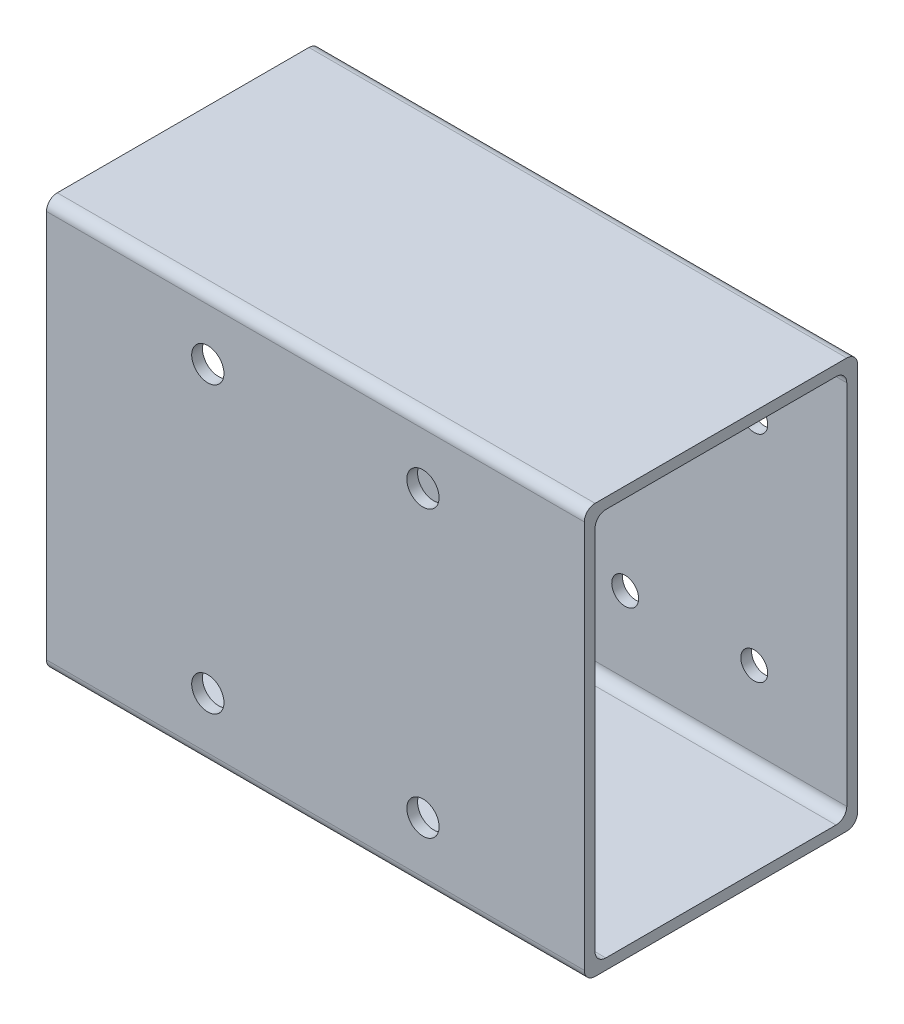
ISO-10303-21;
HEADER;
FILE_DESCRIPTION(('STEP AP214'),'2;1');
FILE_NAME('part.step','',(''),(''),'','','');
FILE_SCHEMA(('AUTOMOTIVE_DESIGN { 1 0 10303 214 1 1 1 1 }'));
ENDSEC;
DATA;
#1=APPLICATION_CONTEXT('core data for automotive mechanical design processes');
#2=APPLICATION_PROTOCOL_DEFINITION('international standard','automotive_design',2000,#1);
#3=PRODUCT_CONTEXT('',#1,'mechanical');
#4=PRODUCT('Part','Part','',(#3));
#5=PRODUCT_RELATED_PRODUCT_CATEGORY('part','',(#4));
#6=PRODUCT_DEFINITION_FORMATION('','',#4);
#7=PRODUCT_DEFINITION_CONTEXT('part definition',#1,'design');
#8=PRODUCT_DEFINITION('design','',#6,#7);
#9=PRODUCT_DEFINITION_SHAPE('','',#8);
#10=(LENGTH_UNIT() NAMED_UNIT(*) SI_UNIT(.MILLI.,.METRE.));
#11=(NAMED_UNIT(*) PLANE_ANGLE_UNIT() SI_UNIT($,.RADIAN.));
#12=(NAMED_UNIT(*) SI_UNIT($,.STERADIAN.) SOLID_ANGLE_UNIT());
#13=UNCERTAINTY_MEASURE_WITH_UNIT(LENGTH_MEASURE(1.E-05),#10,'distance_accuracy_value','');
#14=(GEOMETRIC_REPRESENTATION_CONTEXT(3) GLOBAL_UNCERTAINTY_ASSIGNED_CONTEXT((#13)) GLOBAL_UNIT_ASSIGNED_CONTEXT((#10,
#11,#12)) REPRESENTATION_CONTEXT('',''));
#15=CARTESIAN_POINT('',(0.,0.,0.));
#16=DIRECTION('',(0.,0.,1.));
#17=DIRECTION('',(1.,0.,0.));
#18=AXIS2_PLACEMENT_3D('',#15,#16,#17);
#19=CARTESIAN_POINT('',(-100.,38.1,25.4));
#20=DIRECTION('',(0.,0.,1.));
#21=DIRECTION('',(0.,-1.,0.));
#22=AXIS2_PLACEMENT_3D('',#19,#20,#21);
#23=PLANE('',#22);
#24=CARTESIAN_POINT('',(-30.,-26.5,25.4));
#25=DIRECTION('',(0.,0.,1.));
#26=DIRECTION('',(1.,0.,0.));
#27=AXIS2_PLACEMENT_3D('',#24,#25,#26);
#28=CIRCLE('',#27,3.);
#29=CARTESIAN_POINT('',(-27.,-26.5,25.4));
#30=VERTEX_POINT('',#29);
#31=EDGE_CURVE('E324',#30,#30,#28,.T.);
#32=ORIENTED_EDGE('',*,*,#31,.F.);
#33=EDGE_LOOP('',(#32));
#34=FACE_BOUND('',#33,.T.);
#35=CARTESIAN_POINT('',(-70.,-26.5,25.4));
#36=DIRECTION('',(0.,0.,1.));
#37=DIRECTION('',(1.,0.,0.));
#38=AXIS2_PLACEMENT_3D('',#35,#36,#37);
#39=CIRCLE('',#38,3.00000000000001);
#40=CARTESIAN_POINT('',(-67.,-26.5,25.4));
#41=VERTEX_POINT('',#40);
#42=EDGE_CURVE('E363',#41,#41,#39,.T.);
#43=ORIENTED_EDGE('',*,*,#42,.F.);
#44=EDGE_LOOP('',(#43));
#45=FACE_BOUND('',#44,.T.);
#46=CARTESIAN_POINT('',(-70.,26.5,25.4));
#47=DIRECTION('',(0.,0.,1.));
#48=DIRECTION('',(1.,0.,0.));
#49=AXIS2_PLACEMENT_3D('',#46,#47,#48);
#50=CIRCLE('',#49,3.00000000000001);
#51=CARTESIAN_POINT('',(-67.,26.5,25.4));
#52=VERTEX_POINT('',#51);
#53=EDGE_CURVE('E359',#52,#52,#50,.T.);
#54=ORIENTED_EDGE('',*,*,#53,.F.);
#55=EDGE_LOOP('',(#54));
#56=FACE_BOUND('',#55,.T.);
#57=CARTESIAN_POINT('',(-30.,26.5,25.4));
#58=DIRECTION('',(0.,0.,1.));
#59=DIRECTION('',(1.,0.,0.));
#60=AXIS2_PLACEMENT_3D('',#57,#58,#59);
#61=CIRCLE('',#60,3.);
#62=CARTESIAN_POINT('',(-27.,26.5,25.4));
#63=VERTEX_POINT('',#62);
#64=EDGE_CURVE('E290',#63,#63,#61,.T.);
#65=ORIENTED_EDGE('',*,*,#64,.F.);
#66=EDGE_LOOP('',(#65));
#67=FACE_BOUND('',#66,.T.);
#68=DIRECTION('',(0.,-1.,0.));
#69=VECTOR('',#68,1.);
#70=CARTESIAN_POINT('',(-100.,38.1,25.4));
#71=LINE('',#70,#69);
#72=CARTESIAN_POINT('',(-100.,36.1,25.4));
#73=VERTEX_POINT('',#72);
#74=CARTESIAN_POINT('',(-100.,-36.0999999999999,25.4));
#75=VERTEX_POINT('',#74);
#76=EDGE_CURVE('E404',#73,#75,#71,.T.);
#77=ORIENTED_EDGE('',*,*,#76,.T.);
#78=DIRECTION('',(1.,0.,0.));
#79=VECTOR('',#78,1.);
#80=CARTESIAN_POINT('',(-100.,-36.1,25.4));
#81=LINE('',#80,#79);
#82=CARTESIAN_POINT('',(0.,-36.0999999999999,25.4));
#83=VERTEX_POINT('',#82);
#84=EDGE_CURVE('E228',#75,#83,#81,.T.);
#85=ORIENTED_EDGE('',*,*,#84,.T.);
#86=DIRECTION('',(0.,-1.,0.));
#87=VECTOR('',#86,1.);
#88=CARTESIAN_POINT('',(0.,38.1,25.4));
#89=LINE('',#88,#87);
#90=CARTESIAN_POINT('',(0.,36.1,25.4));
#91=VERTEX_POINT('',#90);
#92=EDGE_CURVE('E166',#91,#83,#89,.T.);
#93=ORIENTED_EDGE('',*,*,#92,.F.);
#94=DIRECTION('',(1.,0.,0.));
#95=VECTOR('',#94,1.);
#96=CARTESIAN_POINT('',(-100.,36.1,25.4));
#97=LINE('',#96,#95);
#98=EDGE_CURVE('E225',#91,#73,#97,.F.);
#99=ORIENTED_EDGE('',*,*,#98,.T.);
#100=EDGE_LOOP('',(#77,#85,#93,#99));
#101=FACE_BOUND('',#100,.T.);
#102=ADVANCED_FACE('F44',(#34,#45,#56,#67,#101),#23,.T.);
#103=CARTESIAN_POINT('',(-100.,38.1,-25.4));
#104=DIRECTION('',(0.,1.,0.));
#105=DIRECTION('',(0.,0.,1.));
#106=AXIS2_PLACEMENT_3D('',#103,#104,#105);
#107=PLANE('',#106);
#108=DIRECTION('',(0.,0.,1.));
#109=VECTOR('',#108,1.);
#110=CARTESIAN_POINT('',(-100.,38.1,-25.4));
#111=LINE('',#110,#109);
#112=CARTESIAN_POINT('',(-100.,38.1,-23.4));
#113=VERTEX_POINT('',#112);
#114=CARTESIAN_POINT('',(-100.,38.1,23.4));
#115=VERTEX_POINT('',#114);
#116=EDGE_CURVE('E190',#113,#115,#111,.T.);
#117=ORIENTED_EDGE('',*,*,#116,.T.);
#118=DIRECTION('',(1.,0.,0.));
#119=VECTOR('',#118,1.);
#120=CARTESIAN_POINT('',(-100.,38.1,23.4));
#121=LINE('',#120,#119);
#122=CARTESIAN_POINT('',(0.,38.1,23.4));
#123=VERTEX_POINT('',#122);
#124=EDGE_CURVE('E233',#115,#123,#121,.T.);
#125=ORIENTED_EDGE('',*,*,#124,.T.);
#126=DIRECTION('',(0.,0.,1.));
#127=VECTOR('',#126,1.);
#128=CARTESIAN_POINT('',(0.,38.1,-25.4));
#129=LINE('',#128,#127);
#130=CARTESIAN_POINT('',(0.,38.1,-23.4));
#131=VERTEX_POINT('',#130);
#132=EDGE_CURVE('E199',#131,#123,#129,.T.);
#133=ORIENTED_EDGE('',*,*,#132,.F.);
#134=DIRECTION('',(1.,0.,0.));
#135=VECTOR('',#134,1.);
#136=CARTESIAN_POINT('',(-100.,38.1,-23.4));
#137=LINE('',#136,#135);
#138=EDGE_CURVE('E69',#131,#113,#137,.F.);
#139=ORIENTED_EDGE('',*,*,#138,.T.);
#140=EDGE_LOOP('',(#117,#125,#133,#139));
#141=FACE_BOUND('',#140,.T.);
#142=ADVANCED_FACE('F420',(#141),#107,.T.);
#143=CARTESIAN_POINT('',(-100.,38.1,-25.4));
#144=DIRECTION('',(0.,0.,-1.));
#145=DIRECTION('',(0.,1.,0.));
#146=AXIS2_PLACEMENT_3D('',#143,#144,#145);
#147=PLANE('',#146);
#148=CARTESIAN_POINT('',(-17.2,-20.,-25.4));
#149=DIRECTION('',(0.,0.,-1.));
#150=DIRECTION('',(0.,1.,0.));
#151=AXIS2_PLACEMENT_3D('',#148,#149,#150);
#152=CIRCLE('',#151,2.5);
#153=CARTESIAN_POINT('',(-17.2,-17.5,-25.4));
#154=VERTEX_POINT('',#153);
#155=EDGE_CURVE('E491',#154,#154,#152,.T.);
#156=ORIENTED_EDGE('',*,*,#155,.F.);
#157=EDGE_LOOP('',(#156));
#158=FACE_BOUND('',#157,.T.);
#159=CARTESIAN_POINT('',(-41.2,-20.,-25.4));
#160=DIRECTION('',(0.,0.,-1.));
#161=DIRECTION('',(0.,1.,0.));
#162=AXIS2_PLACEMENT_3D('',#159,#160,#161);
#163=CIRCLE('',#162,2.5);
#164=CARTESIAN_POINT('',(-41.2,-17.5,-25.4));
#165=VERTEX_POINT('',#164);
#166=EDGE_CURVE('E495',#165,#165,#163,.T.);
#167=ORIENTED_EDGE('',*,*,#166,.F.);
#168=EDGE_LOOP('',(#167));
#169=FACE_BOUND('',#168,.T.);
#170=CARTESIAN_POINT('',(-41.2,20.,-25.4));
#171=DIRECTION('',(0.,0.,-1.));
#172=DIRECTION('',(0.,1.,0.));
#173=AXIS2_PLACEMENT_3D('',#170,#171,#172);
#174=CIRCLE('',#173,2.5);
#175=CARTESIAN_POINT('',(-41.2,22.5,-25.4));
#176=VERTEX_POINT('',#175);
#177=EDGE_CURVE('E499',#176,#176,#174,.T.);
#178=ORIENTED_EDGE('',*,*,#177,.F.);
#179=EDGE_LOOP('',(#178));
#180=FACE_BOUND('',#179,.T.);
#181=CARTESIAN_POINT('',(-17.2,20.,-25.4));
#182=DIRECTION('',(0.,0.,-1.));
#183=DIRECTION('',(0.,1.,0.));
#184=AXIS2_PLACEMENT_3D('',#181,#182,#183);
#185=CIRCLE('',#184,2.5);
#186=CARTESIAN_POINT('',(-17.2,22.5,-25.4));
#187=VERTEX_POINT('',#186);
#188=EDGE_CURVE('E330',#187,#187,#185,.T.);
#189=ORIENTED_EDGE('',*,*,#188,.F.);
#190=EDGE_LOOP('',(#189));
#191=FACE_BOUND('',#190,.T.);
#192=CARTESIAN_POINT('',(-74.6,0.,-25.4));
#193=DIRECTION('',(0.,0.,-1.));
#194=DIRECTION('',(0.,1.,0.));
#195=AXIS2_PLACEMENT_3D('',#192,#193,#194);
#196=CIRCLE('',#195,2.5);
#197=CARTESIAN_POINT('',(-74.6,2.49999999999999,-25.4));
#198=VERTEX_POINT('',#197);
#199=EDGE_CURVE('E340',#198,#198,#196,.T.);
#200=ORIENTED_EDGE('',*,*,#199,.F.);
#201=EDGE_LOOP('',(#200));
#202=FACE_BOUND('',#201,.T.);
#203=CARTESIAN_POINT('',(-90.,-20.,-25.4));
#204=DIRECTION('',(0.,0.,-1.));
#205=DIRECTION('',(0.,1.,0.));
#206=AXIS2_PLACEMENT_3D('',#203,#204,#205);
#207=CIRCLE('',#206,2.50000000000001);
#208=CARTESIAN_POINT('',(-90.,-17.5,-25.4));
#209=VERTEX_POINT('',#208);
#210=EDGE_CURVE('E345',#209,#209,#207,.T.);
#211=ORIENTED_EDGE('',*,*,#210,.F.);
#212=EDGE_LOOP('',(#211));
#213=FACE_BOUND('',#212,.T.);
#214=CARTESIAN_POINT('',(-59.2,-20.,-25.4));
#215=DIRECTION('',(0.,0.,-1.));
#216=DIRECTION('',(0.,1.,0.));
#217=AXIS2_PLACEMENT_3D('',#214,#215,#216);
#218=CIRCLE('',#217,2.5);
#219=CARTESIAN_POINT('',(-59.2,-17.5,-25.4));
#220=VERTEX_POINT('',#219);
#221=EDGE_CURVE('E351',#220,#220,#218,.T.);
#222=ORIENTED_EDGE('',*,*,#221,.F.);
#223=EDGE_LOOP('',(#222));
#224=FACE_BOUND('',#223,.T.);
#225=CARTESIAN_POINT('',(-59.2,20.,-25.4));
#226=DIRECTION('',(0.,0.,-1.));
#227=DIRECTION('',(0.,1.,0.));
#228=AXIS2_PLACEMENT_3D('',#225,#226,#227);
#229=CIRCLE('',#228,2.5);
#230=CARTESIAN_POINT('',(-59.2,22.5,-25.4));
#231=VERTEX_POINT('',#230);
#232=EDGE_CURVE('E358',#231,#231,#229,.T.);
#233=ORIENTED_EDGE('',*,*,#232,.F.);
#234=EDGE_LOOP('',(#233));
#235=FACE_BOUND('',#234,.T.);
#236=CARTESIAN_POINT('',(-90.,20.,-25.4));
#237=DIRECTION('',(0.,0.,-1.));
#238=DIRECTION('',(0.,1.,0.));
#239=AXIS2_PLACEMENT_3D('',#236,#237,#238);
#240=CIRCLE('',#239,2.5);
#241=CARTESIAN_POINT('',(-90.,22.5,-25.4));
#242=VERTEX_POINT('',#241);
#243=EDGE_CURVE('E308',#242,#242,#240,.T.);
#244=ORIENTED_EDGE('',*,*,#243,.F.);
#245=EDGE_LOOP('',(#244));
#246=FACE_BOUND('',#245,.T.);
#247=DIRECTION('',(0.,1.,0.));
#248=VECTOR('',#247,1.);
#249=CARTESIAN_POINT('',(0.,38.1,-25.4));
#250=LINE('',#249,#248);
#251=CARTESIAN_POINT('',(0.,-36.0999999999999,-25.4));
#252=VERTEX_POINT('',#251);
#253=CARTESIAN_POINT('',(0.,36.1,-25.4));
#254=VERTEX_POINT('',#253);
#255=EDGE_CURVE('E184',#252,#254,#250,.T.);
#256=ORIENTED_EDGE('',*,*,#255,.F.);
#257=DIRECTION('',(1.,0.,0.));
#258=VECTOR('',#257,1.);
#259=CARTESIAN_POINT('',(-100.,-36.1,-25.4));
#260=LINE('',#259,#258);
#261=CARTESIAN_POINT('',(-100.,-36.0999999999999,-25.4));
#262=VERTEX_POINT('',#261);
#263=EDGE_CURVE('E212',#252,#262,#260,.F.);
#264=ORIENTED_EDGE('',*,*,#263,.T.);
#265=DIRECTION('',(0.,1.,0.));
#266=VECTOR('',#265,1.);
#267=CARTESIAN_POINT('',(-100.,38.1,-25.4));
#268=LINE('',#267,#266);
#269=CARTESIAN_POINT('',(-100.,36.1,-25.4));
#270=VERTEX_POINT('',#269);
#271=EDGE_CURVE('E196',#262,#270,#268,.T.);
#272=ORIENTED_EDGE('',*,*,#271,.T.);
#273=DIRECTION('',(1.,0.,0.));
#274=VECTOR('',#273,1.);
#275=CARTESIAN_POINT('',(-100.,36.1,-25.4));
#276=LINE('',#275,#274);
#277=EDGE_CURVE('E208',#270,#254,#276,.T.);
#278=ORIENTED_EDGE('',*,*,#277,.T.);
#279=EDGE_LOOP('',(#256,#264,#272,#278));
#280=FACE_BOUND('',#279,.T.);
#281=ADVANCED_FACE('F430',(#158,#169,#180,#191,#202,#213,#224,#235,#246,#280),#147,.T.);
#282=CARTESIAN_POINT('',(-100.,-38.1,-25.4));
#283=DIRECTION('',(0.,-1.,0.));
#284=DIRECTION('',(0.,0.,-1.));
#285=AXIS2_PLACEMENT_3D('',#282,#283,#284);
#286=PLANE('',#285);
#287=DIRECTION('',(0.,0.,-1.));
#288=VECTOR('',#287,1.);
#289=CARTESIAN_POINT('',(-100.,-38.1,-25.4));
#290=LINE('',#289,#288);
#291=CARTESIAN_POINT('',(-100.,-38.1,23.4));
#292=VERTEX_POINT('',#291);
#293=CARTESIAN_POINT('',(-100.,-38.1,-23.4));
#294=VERTEX_POINT('',#293);
#295=EDGE_CURVE('E408',#292,#294,#290,.T.);
#296=ORIENTED_EDGE('',*,*,#295,.T.);
#297=DIRECTION('',(1.,0.,0.));
#298=VECTOR('',#297,1.);
#299=CARTESIAN_POINT('',(-100.,-38.1,-23.4));
#300=LINE('',#299,#298);
#301=CARTESIAN_POINT('',(0.,-38.1,-23.4));
#302=VERTEX_POINT('',#301);
#303=EDGE_CURVE('E182',#294,#302,#300,.T.);
#304=ORIENTED_EDGE('',*,*,#303,.T.);
#305=DIRECTION('',(0.,0.,-1.));
#306=VECTOR('',#305,1.);
#307=CARTESIAN_POINT('',(0.,-38.1,-25.4));
#308=LINE('',#307,#306);
#309=CARTESIAN_POINT('',(0.,-38.1,23.4));
#310=VERTEX_POINT('',#309);
#311=EDGE_CURVE('E164',#310,#302,#308,.T.);
#312=ORIENTED_EDGE('',*,*,#311,.F.);
#313=DIRECTION('',(1.,0.,0.));
#314=VECTOR('',#313,1.);
#315=CARTESIAN_POINT('',(-100.,-38.1,23.4));
#316=LINE('',#315,#314);
#317=EDGE_CURVE('E179',#310,#292,#316,.F.);
#318=ORIENTED_EDGE('',*,*,#317,.T.);
#319=EDGE_LOOP('',(#296,#304,#312,#318));
#320=FACE_BOUND('',#319,.T.);
#321=ADVANCED_FACE('F178',(#320),#286,.T.);
#322=CARTESIAN_POINT('',(-100.,0.,0.));
#323=DIRECTION('',(-1.,0.,0.));
#324=DIRECTION('',(0.,0.,1.));
#325=AXIS2_PLACEMENT_3D('',#322,#323,#324);
#326=PLANE('',#325);
#327=DIRECTION('',(0.,0.,1.));
#328=VECTOR('',#327,1.);
#329=CARTESIAN_POINT('',(-100.,36.1,-23.4));
#330=LINE('',#329,#328);
#331=CARTESIAN_POINT('',(-100.,36.1,-21.4));
#332=VERTEX_POINT('',#331);
#333=CARTESIAN_POINT('',(-100.,36.1,21.4));
#334=VERTEX_POINT('',#333);
#335=EDGE_CURVE('E386',#332,#334,#330,.T.);
#336=ORIENTED_EDGE('',*,*,#335,.T.);
#337=CARTESIAN_POINT('',(-100.,34.1,21.4));
#338=DIRECTION('',(-1.,0.,0.));
#339=DIRECTION('',(0.,0.,1.));
#340=AXIS2_PLACEMENT_3D('',#337,#338,#339);
#341=CIRCLE('',#340,2.);
#342=CARTESIAN_POINT('',(-100.,34.1,23.4));
#343=VERTEX_POINT('',#342);
#344=EDGE_CURVE('E11',#334,#343,#341,.F.);
#345=ORIENTED_EDGE('',*,*,#344,.T.);
#346=DIRECTION('',(0.,-1.,0.));
#347=VECTOR('',#346,1.);
#348=CARTESIAN_POINT('',(-100.,36.1,23.4));
#349=LINE('',#348,#347);
#350=CARTESIAN_POINT('',(-100.,-34.1,23.4));
#351=VERTEX_POINT('',#350);
#352=EDGE_CURVE('E373',#343,#351,#349,.T.);
#353=ORIENTED_EDGE('',*,*,#352,.T.);
#354=CARTESIAN_POINT('',(-100.,-34.1,21.4));
#355=DIRECTION('',(-1.,0.,0.));
#356=DIRECTION('',(0.,0.,1.));
#357=AXIS2_PLACEMENT_3D('',#354,#355,#356);
#358=CIRCLE('',#357,2.);
#359=CARTESIAN_POINT('',(-100.,-36.1,21.4));
#360=VERTEX_POINT('',#359);
#361=EDGE_CURVE('E280',#351,#360,#358,.F.);
#362=ORIENTED_EDGE('',*,*,#361,.T.);
#363=DIRECTION('',(0.,0.,-1.));
#364=VECTOR('',#363,1.);
#365=CARTESIAN_POINT('',(-100.,-36.1,-23.4));
#366=LINE('',#365,#364);
#367=CARTESIAN_POINT('',(-100.,-36.1,-21.4));
#368=VERTEX_POINT('',#367);
#369=EDGE_CURVE('E377',#360,#368,#366,.T.);
#370=ORIENTED_EDGE('',*,*,#369,.T.);
#371=CARTESIAN_POINT('',(-100.,-34.1,-21.4));
#372=DIRECTION('',(-1.,0.,0.));
#373=DIRECTION('',(0.,0.,1.));
#374=AXIS2_PLACEMENT_3D('',#371,#372,#373);
#375=CIRCLE('',#374,2.);
#376=CARTESIAN_POINT('',(-100.,-34.1,-23.4));
#377=VERTEX_POINT('',#376);
#378=EDGE_CURVE('E268',#368,#377,#375,.F.);
#379=ORIENTED_EDGE('',*,*,#378,.T.);
#380=DIRECTION('',(0.,1.,0.));
#381=VECTOR('',#380,1.);
#382=CARTESIAN_POINT('',(-100.,36.1,-23.4));
#383=LINE('',#382,#381);
#384=CARTESIAN_POINT('',(-100.,34.1,-23.4));
#385=VERTEX_POINT('',#384);
#386=EDGE_CURVE('E382',#377,#385,#383,.T.);
#387=ORIENTED_EDGE('',*,*,#386,.T.);
#388=CARTESIAN_POINT('',(-100.,34.1,-21.4));
#389=DIRECTION('',(-1.,0.,0.));
#390=DIRECTION('',(0.,0.,1.));
#391=AXIS2_PLACEMENT_3D('',#388,#389,#390);
#392=CIRCLE('',#391,2.);
#393=EDGE_CURVE('E274',#385,#332,#392,.F.);
#394=ORIENTED_EDGE('',*,*,#393,.T.);
#395=EDGE_LOOP('',(#336,#345,#353,#362,#370,#379,#387,#394));
#396=FACE_BOUND('',#395,.T.);
#397=ORIENTED_EDGE('',*,*,#271,.F.);
#398=CARTESIAN_POINT('',(-100.,-36.1,-23.4));
#399=DIRECTION('',(-1.,0.,0.));
#400=DIRECTION('',(0.,0.,1.));
#401=AXIS2_PLACEMENT_3D('',#398,#399,#400);
#402=CIRCLE('',#401,2.);
#403=EDGE_CURVE('E222',#262,#294,#402,.T.);
#404=ORIENTED_EDGE('',*,*,#403,.T.);
#405=ORIENTED_EDGE('',*,*,#295,.F.);
#406=CARTESIAN_POINT('',(-100.,-36.1,23.4));
#407=DIRECTION('',(-1.,0.,0.));
#408=DIRECTION('',(0.,0.,1.));
#409=AXIS2_PLACEMENT_3D('',#406,#407,#408);
#410=CIRCLE('',#409,2.);
#411=EDGE_CURVE('E188',#292,#75,#410,.T.);
#412=ORIENTED_EDGE('',*,*,#411,.T.);
#413=ORIENTED_EDGE('',*,*,#76,.F.);
#414=CARTESIAN_POINT('',(-100.,36.1,23.4));
#415=DIRECTION('',(-1.,0.,0.));
#416=DIRECTION('',(0.,0.,1.));
#417=AXIS2_PLACEMENT_3D('',#414,#415,#416);
#418=CIRCLE('',#417,2.);
#419=EDGE_CURVE('E62',#73,#115,#418,.T.);
#420=ORIENTED_EDGE('',*,*,#419,.T.);
#421=ORIENTED_EDGE('',*,*,#116,.F.);
#422=CARTESIAN_POINT('',(-100.,36.1,-23.4));
#423=DIRECTION('',(-1.,0.,0.));
#424=DIRECTION('',(0.,0.,1.));
#425=AXIS2_PLACEMENT_3D('',#422,#423,#424);
#426=CIRCLE('',#425,2.);
#427=EDGE_CURVE('E215',#113,#270,#426,.T.);
#428=ORIENTED_EDGE('',*,*,#427,.T.);
#429=EDGE_LOOP('',(#397,#404,#405,#412,#413,#420,#421,#428));
#430=FACE_BOUND('',#429,.T.);
#431=ADVANCED_FACE('F427',(#396,#430),#326,.T.);
#432=CARTESIAN_POINT('',(0.,0.,0.));
#433=DIRECTION('',(-1.,0.,0.));
#434=DIRECTION('',(0.,0.,1.));
#435=AXIS2_PLACEMENT_3D('',#432,#433,#434);
#436=PLANE('',#435);
#437=DIRECTION('',(0.,0.,-1.));
#438=VECTOR('',#437,1.);
#439=CARTESIAN_POINT('',(0.,-36.1,-23.4));
#440=LINE('',#439,#438);
#441=CARTESIAN_POINT('',(0.,-36.1,21.4));
#442=VERTEX_POINT('',#441);
#443=CARTESIAN_POINT('',(0.,-36.1,-21.4));
#444=VERTEX_POINT('',#443);
#445=EDGE_CURVE('E393',#442,#444,#440,.T.);
#446=ORIENTED_EDGE('',*,*,#445,.F.);
#447=CARTESIAN_POINT('',(0.,-34.1,21.4));
#448=DIRECTION('',(-1.,0.,0.));
#449=DIRECTION('',(0.,0.,1.));
#450=AXIS2_PLACEMENT_3D('',#447,#448,#449);
#451=CIRCLE('',#450,2.);
#452=CARTESIAN_POINT('',(0.,-34.1,23.4));
#453=VERTEX_POINT('',#452);
#454=EDGE_CURVE('E277',#442,#453,#451,.T.);
#455=ORIENTED_EDGE('',*,*,#454,.T.);
#456=DIRECTION('',(0.,-1.,0.));
#457=VECTOR('',#456,1.);
#458=CARTESIAN_POINT('',(0.,36.1,23.4));
#459=LINE('',#458,#457);
#460=CARTESIAN_POINT('',(0.,34.1,23.4));
#461=VERTEX_POINT('',#460);
#462=EDGE_CURVE('E302',#461,#453,#459,.T.);
#463=ORIENTED_EDGE('',*,*,#462,.F.);
#464=CARTESIAN_POINT('',(0.,34.1,21.4));
#465=DIRECTION('',(-1.,0.,0.));
#466=DIRECTION('',(0.,0.,1.));
#467=AXIS2_PLACEMENT_3D('',#464,#465,#466);
#468=CIRCLE('',#467,2.);
#469=CARTESIAN_POINT('',(0.,36.1,21.4));
#470=VERTEX_POINT('',#469);
#471=EDGE_CURVE('E54',#461,#470,#468,.T.);
#472=ORIENTED_EDGE('',*,*,#471,.T.);
#473=DIRECTION('',(0.,0.,1.));
#474=VECTOR('',#473,1.);
#475=CARTESIAN_POINT('',(0.,36.1,-23.4));
#476=LINE('',#475,#474);
#477=CARTESIAN_POINT('',(0.,36.1,-21.4));
#478=VERTEX_POINT('',#477);
#479=EDGE_CURVE('E378',#478,#470,#476,.T.);
#480=ORIENTED_EDGE('',*,*,#479,.F.);
#481=CARTESIAN_POINT('',(0.,34.1,-21.4));
#482=DIRECTION('',(-1.,0.,0.));
#483=DIRECTION('',(0.,0.,1.));
#484=AXIS2_PLACEMENT_3D('',#481,#482,#483);
#485=CIRCLE('',#484,2.);
#486=CARTESIAN_POINT('',(0.,34.1,-23.4));
#487=VERTEX_POINT('',#486);
#488=EDGE_CURVE('E271',#478,#487,#485,.T.);
#489=ORIENTED_EDGE('',*,*,#488,.T.);
#490=DIRECTION('',(0.,1.,0.));
#491=VECTOR('',#490,1.);
#492=CARTESIAN_POINT('',(0.,36.1,-23.4));
#493=LINE('',#492,#491);
#494=CARTESIAN_POINT('',(0.,-34.1,-23.4));
#495=VERTEX_POINT('',#494);
#496=EDGE_CURVE('E397',#495,#487,#493,.T.);
#497=ORIENTED_EDGE('',*,*,#496,.F.);
#498=CARTESIAN_POINT('',(0.,-34.1,-21.4));
#499=DIRECTION('',(-1.,0.,0.));
#500=DIRECTION('',(0.,0.,1.));
#501=AXIS2_PLACEMENT_3D('',#498,#499,#500);
#502=CIRCLE('',#501,2.);
#503=EDGE_CURVE('E265',#495,#444,#502,.T.);
#504=ORIENTED_EDGE('',*,*,#503,.T.);
#505=EDGE_LOOP('',(#446,#455,#463,#472,#480,#489,#497,#504));
#506=FACE_BOUND('',#505,.T.);
#507=ORIENTED_EDGE('',*,*,#311,.T.);
#508=CARTESIAN_POINT('',(0.,-36.1,-23.4));
#509=DIRECTION('',(-1.,0.,0.));
#510=DIRECTION('',(0.,0.,1.));
#511=AXIS2_PLACEMENT_3D('',#508,#509,#510);
#512=CIRCLE('',#511,2.);
#513=EDGE_CURVE('E172',#302,#252,#512,.F.);
#514=ORIENTED_EDGE('',*,*,#513,.T.);
#515=ORIENTED_EDGE('',*,*,#255,.T.);
#516=CARTESIAN_POINT('',(0.,36.1,-23.4));
#517=DIRECTION('',(-1.,0.,0.));
#518=DIRECTION('',(0.,0.,1.));
#519=AXIS2_PLACEMENT_3D('',#516,#517,#518);
#520=CIRCLE('',#519,2.);
#521=EDGE_CURVE('E194',#254,#131,#520,.F.);
#522=ORIENTED_EDGE('',*,*,#521,.T.);
#523=ORIENTED_EDGE('',*,*,#132,.T.);
#524=CARTESIAN_POINT('',(0.,36.1,23.4));
#525=DIRECTION('',(-1.,0.,0.));
#526=DIRECTION('',(0.,0.,1.));
#527=AXIS2_PLACEMENT_3D('',#524,#525,#526);
#528=CIRCLE('',#527,2.);
#529=EDGE_CURVE('E173',#123,#91,#528,.F.);
#530=ORIENTED_EDGE('',*,*,#529,.T.);
#531=ORIENTED_EDGE('',*,*,#92,.T.);
#532=CARTESIAN_POINT('',(0.,-36.1,23.4));
#533=DIRECTION('',(-1.,0.,0.));
#534=DIRECTION('',(0.,0.,1.));
#535=AXIS2_PLACEMENT_3D('',#532,#533,#534);
#536=CIRCLE('',#535,2.);
#537=EDGE_CURVE('E161',#83,#310,#536,.F.);
#538=ORIENTED_EDGE('',*,*,#537,.T.);
#539=EDGE_LOOP('',(#507,#514,#515,#522,#523,#530,#531,#538));
#540=FACE_BOUND('',#539,.T.);
#541=ADVANCED_FACE('F163',(#506,#540),#436,.F.);
#542=CARTESIAN_POINT('',(-100.,36.1,23.4));
#543=DIRECTION('',(0.,0.,1.));
#544=DIRECTION('',(1.,0.,0.));
#545=AXIS2_PLACEMENT_3D('',#542,#543,#544);
#546=PLANE('',#545);
#547=CARTESIAN_POINT('',(-30.,-26.5,23.4));
#548=DIRECTION('',(0.,0.,1.));
#549=DIRECTION('',(1.,0.,0.));
#550=AXIS2_PLACEMENT_3D('',#547,#548,#549);
#551=CIRCLE('',#550,3.);
#552=CARTESIAN_POINT('',(-27.,-26.5,23.4));
#553=VERTEX_POINT('',#552);
#554=EDGE_CURVE('E298',#553,#553,#551,.T.);
#555=ORIENTED_EDGE('',*,*,#554,.T.);
#556=EDGE_LOOP('',(#555));
#557=FACE_BOUND('',#556,.T.);
#558=CARTESIAN_POINT('',(-70.,-26.5,23.4));
#559=DIRECTION('',(0.,0.,1.));
#560=DIRECTION('',(1.,0.,0.));
#561=AXIS2_PLACEMENT_3D('',#558,#559,#560);
#562=CIRCLE('',#561,3.00000000000001);
#563=CARTESIAN_POINT('',(-67.,-26.5,23.4));
#564=VERTEX_POINT('',#563);
#565=EDGE_CURVE('E294',#564,#564,#562,.T.);
#566=ORIENTED_EDGE('',*,*,#565,.T.);
#567=EDGE_LOOP('',(#566));
#568=FACE_BOUND('',#567,.T.);
#569=CARTESIAN_POINT('',(-70.,26.5,23.4));
#570=DIRECTION('',(0.,0.,1.));
#571=DIRECTION('',(1.,0.,0.));
#572=AXIS2_PLACEMENT_3D('',#569,#570,#571);
#573=CIRCLE('',#572,3.00000000000001);
#574=CARTESIAN_POINT('',(-67.,26.5,23.4));
#575=VERTEX_POINT('',#574);
#576=EDGE_CURVE('E289',#575,#575,#573,.T.);
#577=ORIENTED_EDGE('',*,*,#576,.T.);
#578=EDGE_LOOP('',(#577));
#579=FACE_BOUND('',#578,.T.);
#580=CARTESIAN_POINT('',(-30.,26.5,23.4));
#581=DIRECTION('',(0.,0.,1.));
#582=DIRECTION('',(1.,0.,0.));
#583=AXIS2_PLACEMENT_3D('',#580,#581,#582);
#584=CIRCLE('',#583,3.);
#585=CARTESIAN_POINT('',(-27.,26.5,23.4));
#586=VERTEX_POINT('',#585);
#587=EDGE_CURVE('E285',#586,#586,#584,.T.);
#588=ORIENTED_EDGE('',*,*,#587,.T.);
#589=EDGE_LOOP('',(#588));
#590=FACE_BOUND('',#589,.T.);
#591=ORIENTED_EDGE('',*,*,#462,.T.);
#592=DIRECTION('',(1.,0.,0.));
#593=VECTOR('',#592,1.);
#594=CARTESIAN_POINT('',(-100.,-34.1,23.4));
#595=LINE('',#594,#593);
#596=EDGE_CURVE('E262',#453,#351,#595,.F.);
#597=ORIENTED_EDGE('',*,*,#596,.T.);
#598=ORIENTED_EDGE('',*,*,#352,.F.);
#599=DIRECTION('',(1.,0.,0.));
#600=VECTOR('',#599,1.);
#601=CARTESIAN_POINT('',(0.,34.1,23.4));
#602=LINE('',#601,#600);
#603=EDGE_CURVE('E258',#343,#461,#602,.T.);
#604=ORIENTED_EDGE('',*,*,#603,.T.);
#605=EDGE_LOOP('',(#591,#597,#598,#604));
#606=FACE_BOUND('',#605,.T.);
#607=ADVANCED_FACE('F474',(#557,#568,#579,#590,#606),#546,.F.);
#608=CARTESIAN_POINT('',(-100.,36.1,-23.4));
#609=DIRECTION('',(0.,1.,0.));
#610=DIRECTION('',(0.,0.,1.));
#611=AXIS2_PLACEMENT_3D('',#608,#609,#610);
#612=PLANE('',#611);
#613=ORIENTED_EDGE('',*,*,#335,.F.);
#614=DIRECTION('',(1.,0.,0.));
#615=VECTOR('',#614,1.);
#616=CARTESIAN_POINT('',(0.,36.1,-21.4));
#617=LINE('',#616,#615);
#618=EDGE_CURVE('E254',#332,#478,#617,.T.);
#619=ORIENTED_EDGE('',*,*,#618,.T.);
#620=ORIENTED_EDGE('',*,*,#479,.T.);
#621=DIRECTION('',(1.,0.,0.));
#622=VECTOR('',#621,1.);
#623=CARTESIAN_POINT('',(-100.,36.1,21.4));
#624=LINE('',#623,#622);
#625=EDGE_CURVE('E251',#470,#334,#624,.F.);
#626=ORIENTED_EDGE('',*,*,#625,.T.);
#627=EDGE_LOOP('',(#613,#619,#620,#626));
#628=FACE_BOUND('',#627,.T.);
#629=ADVANCED_FACE('F470',(#628),#612,.F.);
#630=CARTESIAN_POINT('',(-100.,36.1,-23.4));
#631=DIRECTION('',(0.,0.,-1.));
#632=DIRECTION('',(-1.,0.,0.));
#633=AXIS2_PLACEMENT_3D('',#630,#631,#632);
#634=PLANE('',#633);
#635=CARTESIAN_POINT('',(-17.2,-20.,-23.4));
#636=DIRECTION('',(0.,0.,-1.));
#637=DIRECTION('',(-1.,0.,0.));
#638=AXIS2_PLACEMENT_3D('',#635,#636,#637);
#639=CIRCLE('',#638,2.5);
#640=CARTESIAN_POINT('',(-19.7,-20.,-23.4));
#641=VERTEX_POINT('',#640);
#642=EDGE_CURVE('E48',#641,#641,#639,.T.);
#643=ORIENTED_EDGE('',*,*,#642,.T.);
#644=EDGE_LOOP('',(#643));
#645=FACE_BOUND('',#644,.T.);
#646=CARTESIAN_POINT('',(-41.2,-20.,-23.4));
#647=DIRECTION('',(0.,0.,-1.));
#648=DIRECTION('',(-1.,0.,0.));
#649=AXIS2_PLACEMENT_3D('',#646,#647,#648);
#650=CIRCLE('',#649,2.5);
#651=CARTESIAN_POINT('',(-43.7,-20.,-23.4));
#652=VERTEX_POINT('',#651);
#653=EDGE_CURVE('E333',#652,#652,#650,.T.);
#654=ORIENTED_EDGE('',*,*,#653,.T.);
#655=EDGE_LOOP('',(#654));
#656=FACE_BOUND('',#655,.T.);
#657=CARTESIAN_POINT('',(-41.2,20.,-23.4));
#658=DIRECTION('',(0.,0.,-1.));
#659=DIRECTION('',(-1.,0.,0.));
#660=AXIS2_PLACEMENT_3D('',#657,#658,#659);
#661=CIRCLE('',#660,2.5);
#662=CARTESIAN_POINT('',(-43.7,20.,-23.4));
#663=VERTEX_POINT('',#662);
#664=EDGE_CURVE('E329',#663,#663,#661,.T.);
#665=ORIENTED_EDGE('',*,*,#664,.T.);
#666=EDGE_LOOP('',(#665));
#667=FACE_BOUND('',#666,.T.);
#668=CARTESIAN_POINT('',(-17.2,20.,-23.4));
#669=DIRECTION('',(0.,0.,-1.));
#670=DIRECTION('',(-1.,0.,0.));
#671=AXIS2_PLACEMENT_3D('',#668,#669,#670);
#672=CIRCLE('',#671,2.5);
#673=CARTESIAN_POINT('',(-19.7,20.,-23.4));
#674=VERTEX_POINT('',#673);
#675=EDGE_CURVE('E325',#674,#674,#672,.T.);
#676=ORIENTED_EDGE('',*,*,#675,.T.);
#677=EDGE_LOOP('',(#676));
#678=FACE_BOUND('',#677,.T.);
#679=CARTESIAN_POINT('',(-74.6,0.,-23.4));
#680=DIRECTION('',(0.,0.,-1.));
#681=DIRECTION('',(-1.,0.,0.));
#682=AXIS2_PLACEMENT_3D('',#679,#680,#681);
#683=CIRCLE('',#682,2.5);
#684=CARTESIAN_POINT('',(-77.1,0.,-23.4));
#685=VERTEX_POINT('',#684);
#686=EDGE_CURVE('E320',#685,#685,#683,.T.);
#687=ORIENTED_EDGE('',*,*,#686,.T.);
#688=EDGE_LOOP('',(#687));
#689=FACE_BOUND('',#688,.T.);
#690=CARTESIAN_POINT('',(-90.,-20.,-23.4));
#691=DIRECTION('',(0.,0.,-1.));
#692=DIRECTION('',(-1.,0.,0.));
#693=AXIS2_PLACEMENT_3D('',#690,#691,#692);
#694=CIRCLE('',#693,2.50000000000001);
#695=CARTESIAN_POINT('',(-92.5,-20.,-23.4));
#696=VERTEX_POINT('',#695);
#697=EDGE_CURVE('E316',#696,#696,#694,.T.);
#698=ORIENTED_EDGE('',*,*,#697,.T.);
#699=EDGE_LOOP('',(#698));
#700=FACE_BOUND('',#699,.T.);
#701=CARTESIAN_POINT('',(-59.2,-20.,-23.4));
#702=DIRECTION('',(0.,0.,-1.));
#703=DIRECTION('',(-1.,0.,0.));
#704=AXIS2_PLACEMENT_3D('',#701,#702,#703);
#705=CIRCLE('',#704,2.5);
#706=CARTESIAN_POINT('',(-61.7,-20.,-23.4));
#707=VERTEX_POINT('',#706);
#708=EDGE_CURVE('E312',#707,#707,#705,.T.);
#709=ORIENTED_EDGE('',*,*,#708,.T.);
#710=EDGE_LOOP('',(#709));
#711=FACE_BOUND('',#710,.T.);
#712=CARTESIAN_POINT('',(-59.2,20.,-23.4));
#713=DIRECTION('',(0.,0.,-1.));
#714=DIRECTION('',(-1.,0.,0.));
#715=AXIS2_PLACEMENT_3D('',#712,#713,#714);
#716=CIRCLE('',#715,2.5);
#717=CARTESIAN_POINT('',(-61.7,20.,-23.4));
#718=VERTEX_POINT('',#717);
#719=EDGE_CURVE('E307',#718,#718,#716,.T.);
#720=ORIENTED_EDGE('',*,*,#719,.T.);
#721=EDGE_LOOP('',(#720));
#722=FACE_BOUND('',#721,.T.);
#723=CARTESIAN_POINT('',(-90.,20.,-23.4));
#724=DIRECTION('',(0.,0.,-1.));
#725=DIRECTION('',(-1.,0.,0.));
#726=AXIS2_PLACEMENT_3D('',#723,#724,#725);
#727=CIRCLE('',#726,2.5);
#728=CARTESIAN_POINT('',(-92.5,20.,-23.4));
#729=VERTEX_POINT('',#728);
#730=EDGE_CURVE('E303',#729,#729,#727,.T.);
#731=ORIENTED_EDGE('',*,*,#730,.T.);
#732=EDGE_LOOP('',(#731));
#733=FACE_BOUND('',#732,.T.);
#734=ORIENTED_EDGE('',*,*,#386,.F.);
#735=DIRECTION('',(1.,0.,0.));
#736=VECTOR('',#735,1.);
#737=CARTESIAN_POINT('',(0.,-34.1,-23.4));
#738=LINE('',#737,#736);
#739=EDGE_CURVE('E240',#377,#495,#738,.T.);
#740=ORIENTED_EDGE('',*,*,#739,.T.);
#741=ORIENTED_EDGE('',*,*,#496,.T.);
#742=DIRECTION('',(1.,0.,0.));
#743=VECTOR('',#742,1.);
#744=CARTESIAN_POINT('',(-100.,34.1,-23.4));
#745=LINE('',#744,#743);
#746=EDGE_CURVE('E237',#487,#385,#745,.F.);
#747=ORIENTED_EDGE('',*,*,#746,.T.);
#748=EDGE_LOOP('',(#734,#740,#741,#747));
#749=FACE_BOUND('',#748,.T.);
#750=ADVANCED_FACE('F464',(#645,#656,#667,#678,#689,#700,#711,#722,#733,#749),#634,.F.);
#751=CARTESIAN_POINT('',(-100.,-36.1,-23.4));
#752=DIRECTION('',(0.,-1.,0.));
#753=DIRECTION('',(0.,0.,-1.));
#754=AXIS2_PLACEMENT_3D('',#751,#752,#753);
#755=PLANE('',#754);
#756=ORIENTED_EDGE('',*,*,#445,.T.);
#757=DIRECTION('',(1.,0.,0.));
#758=VECTOR('',#757,1.);
#759=CARTESIAN_POINT('',(-100.,-36.1,-21.4));
#760=LINE('',#759,#758);
#761=EDGE_CURVE('E248',#444,#368,#760,.F.);
#762=ORIENTED_EDGE('',*,*,#761,.T.);
#763=ORIENTED_EDGE('',*,*,#369,.F.);
#764=DIRECTION('',(1.,0.,0.));
#765=VECTOR('',#764,1.);
#766=CARTESIAN_POINT('',(0.,-36.1,21.4));
#767=LINE('',#766,#765);
#768=EDGE_CURVE('E244',#360,#442,#767,.T.);
#769=ORIENTED_EDGE('',*,*,#768,.T.);
#770=EDGE_LOOP('',(#756,#762,#763,#769));
#771=FACE_BOUND('',#770,.T.);
#772=ADVANCED_FACE('F460',(#771),#755,.F.);
#773=CARTESIAN_POINT('',(-100.,-36.1,-23.4));
#774=DIRECTION('',(1.,0.,0.));
#775=DIRECTION('',(0.,0.,-1.));
#776=AXIS2_PLACEMENT_3D('',#773,#774,#775);
#777=CYLINDRICAL_SURFACE('',#776,2.);
#778=ORIENTED_EDGE('',*,*,#403,.F.);
#779=ORIENTED_EDGE('',*,*,#263,.F.);
#780=ORIENTED_EDGE('',*,*,#513,.F.);
#781=ORIENTED_EDGE('',*,*,#303,.F.);
#782=EDGE_LOOP('',(#778,#779,#780,#781));
#783=FACE_BOUND('',#782,.T.);
#784=ADVANCED_FACE('F433',(#783),#777,.T.);
#785=CARTESIAN_POINT('',(-100.,-36.1,23.4));
#786=DIRECTION('',(1.,0.,0.));
#787=DIRECTION('',(0.,0.,-1.));
#788=AXIS2_PLACEMENT_3D('',#785,#786,#787);
#789=CYLINDRICAL_SURFACE('',#788,2.);
#790=ORIENTED_EDGE('',*,*,#411,.F.);
#791=ORIENTED_EDGE('',*,*,#317,.F.);
#792=ORIENTED_EDGE('',*,*,#537,.F.);
#793=ORIENTED_EDGE('',*,*,#84,.F.);
#794=EDGE_LOOP('',(#790,#791,#792,#793));
#795=FACE_BOUND('',#794,.T.);
#796=ADVANCED_FACE('F187',(#795),#789,.T.);
#797=CARTESIAN_POINT('',(-100.,36.1,23.4));
#798=DIRECTION('',(1.,0.,0.));
#799=DIRECTION('',(0.,0.,-1.));
#800=AXIS2_PLACEMENT_3D('',#797,#798,#799);
#801=CYLINDRICAL_SURFACE('',#800,2.);
#802=ORIENTED_EDGE('',*,*,#419,.F.);
#803=ORIENTED_EDGE('',*,*,#98,.F.);
#804=ORIENTED_EDGE('',*,*,#529,.F.);
#805=ORIENTED_EDGE('',*,*,#124,.F.);
#806=EDGE_LOOP('',(#802,#803,#804,#805));
#807=FACE_BOUND('',#806,.T.);
#808=ADVANCED_FACE('F437',(#807),#801,.T.);
#809=CARTESIAN_POINT('',(-100.,36.1,-23.4));
#810=DIRECTION('',(1.,0.,0.));
#811=DIRECTION('',(0.,0.,-1.));
#812=AXIS2_PLACEMENT_3D('',#809,#810,#811);
#813=CYLINDRICAL_SURFACE('',#812,2.);
#814=ORIENTED_EDGE('',*,*,#427,.F.);
#815=ORIENTED_EDGE('',*,*,#138,.F.);
#816=ORIENTED_EDGE('',*,*,#521,.F.);
#817=ORIENTED_EDGE('',*,*,#277,.F.);
#818=EDGE_LOOP('',(#814,#815,#816,#817));
#819=FACE_BOUND('',#818,.T.);
#820=ADVANCED_FACE('F424',(#819),#813,.T.);
#821=CARTESIAN_POINT('',(-100.,-34.1,-21.4));
#822=DIRECTION('',(-1.,0.,0.));
#823=DIRECTION('',(0.,0.,1.));
#824=AXIS2_PLACEMENT_3D('',#821,#822,#823);
#825=CYLINDRICAL_SURFACE('',#824,2.);
#826=ORIENTED_EDGE('',*,*,#378,.F.);
#827=ORIENTED_EDGE('',*,*,#761,.F.);
#828=ORIENTED_EDGE('',*,*,#503,.F.);
#829=ORIENTED_EDGE('',*,*,#739,.F.);
#830=EDGE_LOOP('',(#826,#827,#828,#829));
#831=FACE_BOUND('',#830,.T.);
#832=ADVANCED_FACE('F444',(#831),#825,.F.);
#833=CARTESIAN_POINT('',(-100.,34.1,-21.4));
#834=DIRECTION('',(-1.,0.,0.));
#835=DIRECTION('',(0.,0.,1.));
#836=AXIS2_PLACEMENT_3D('',#833,#834,#835);
#837=CYLINDRICAL_SURFACE('',#836,2.);
#838=ORIENTED_EDGE('',*,*,#393,.F.);
#839=ORIENTED_EDGE('',*,*,#746,.F.);
#840=ORIENTED_EDGE('',*,*,#488,.F.);
#841=ORIENTED_EDGE('',*,*,#618,.F.);
#842=EDGE_LOOP('',(#838,#839,#840,#841));
#843=FACE_BOUND('',#842,.T.);
#844=ADVANCED_FACE('F550',(#843),#837,.F.);
#845=CARTESIAN_POINT('',(-100.,-34.1,21.4));
#846=DIRECTION('',(-1.,0.,0.));
#847=DIRECTION('',(0.,0.,1.));
#848=AXIS2_PLACEMENT_3D('',#845,#846,#847);
#849=CYLINDRICAL_SURFACE('',#848,2.);
#850=ORIENTED_EDGE('',*,*,#361,.F.);
#851=ORIENTED_EDGE('',*,*,#596,.F.);
#852=ORIENTED_EDGE('',*,*,#454,.F.);
#853=ORIENTED_EDGE('',*,*,#768,.F.);
#854=EDGE_LOOP('',(#850,#851,#852,#853));
#855=FACE_BOUND('',#854,.T.);
#856=ADVANCED_FACE('F536',(#855),#849,.F.);
#857=CARTESIAN_POINT('',(-100.,34.1,21.4));
#858=DIRECTION('',(-1.,0.,0.));
#859=DIRECTION('',(0.,0.,1.));
#860=AXIS2_PLACEMENT_3D('',#857,#858,#859);
#861=CYLINDRICAL_SURFACE('',#860,2.);
#862=ORIENTED_EDGE('',*,*,#344,.F.);
#863=ORIENTED_EDGE('',*,*,#625,.F.);
#864=ORIENTED_EDGE('',*,*,#471,.F.);
#865=ORIENTED_EDGE('',*,*,#603,.F.);
#866=EDGE_LOOP('',(#862,#863,#864,#865));
#867=FACE_BOUND('',#866,.T.);
#868=ADVANCED_FACE('F46',(#867),#861,.F.);
#869=CARTESIAN_POINT('',(-30.,26.5,15.4));
#870=DIRECTION('',(0.,0.,1.));
#871=DIRECTION('',(1.,0.,0.));
#872=AXIS2_PLACEMENT_3D('',#869,#870,#871);
#873=CYLINDRICAL_SURFACE('',#872,3.);
#874=ORIENTED_EDGE('',*,*,#64,.T.);
#875=EDGE_LOOP('',(#874));
#876=FACE_BOUND('',#875,.T.);
#877=ORIENTED_EDGE('',*,*,#587,.F.);
#878=EDGE_LOOP('',(#877));
#879=FACE_BOUND('',#878,.T.);
#880=ADVANCED_FACE('F764',(#876,#879),#873,.F.);
#881=CARTESIAN_POINT('',(-70.,26.5,15.4));
#882=DIRECTION('',(0.,0.,1.));
#883=DIRECTION('',(1.,0.,0.));
#884=AXIS2_PLACEMENT_3D('',#881,#882,#883);
#885=CYLINDRICAL_SURFACE('',#884,3.00000000000001);
#886=ORIENTED_EDGE('',*,*,#53,.T.);
#887=EDGE_LOOP('',(#886));
#888=FACE_BOUND('',#887,.T.);
#889=ORIENTED_EDGE('',*,*,#576,.F.);
#890=EDGE_LOOP('',(#889));
#891=FACE_BOUND('',#890,.T.);
#892=ADVANCED_FACE('F754',(#888,#891),#885,.F.);
#893=CARTESIAN_POINT('',(-70.,-26.5,15.4));
#894=DIRECTION('',(0.,0.,1.));
#895=DIRECTION('',(1.,0.,0.));
#896=AXIS2_PLACEMENT_3D('',#893,#894,#895);
#897=CYLINDRICAL_SURFACE('',#896,3.00000000000001);
#898=ORIENTED_EDGE('',*,*,#42,.T.);
#899=EDGE_LOOP('',(#898));
#900=FACE_BOUND('',#899,.T.);
#901=ORIENTED_EDGE('',*,*,#565,.F.);
#902=EDGE_LOOP('',(#901));
#903=FACE_BOUND('',#902,.T.);
#904=ADVANCED_FACE('F744',(#900,#903),#897,.F.);
#905=CARTESIAN_POINT('',(-30.,-26.5,15.4));
#906=DIRECTION('',(0.,0.,1.));
#907=DIRECTION('',(1.,0.,0.));
#908=AXIS2_PLACEMENT_3D('',#905,#906,#907);
#909=CYLINDRICAL_SURFACE('',#908,3.);
#910=ORIENTED_EDGE('',*,*,#31,.T.);
#911=EDGE_LOOP('',(#910));
#912=FACE_BOUND('',#911,.T.);
#913=ORIENTED_EDGE('',*,*,#554,.F.);
#914=EDGE_LOOP('',(#913));
#915=FACE_BOUND('',#914,.T.);
#916=ADVANCED_FACE('F518',(#912,#915),#909,.F.);
#917=CARTESIAN_POINT('',(-90.,20.,-15.4));
#918=DIRECTION('',(0.,0.,-1.));
#919=DIRECTION('',(0.,1.,0.));
#920=AXIS2_PLACEMENT_3D('',#917,#918,#919);
#921=CYLINDRICAL_SURFACE('',#920,2.5);
#922=ORIENTED_EDGE('',*,*,#243,.T.);
#923=EDGE_LOOP('',(#922));
#924=FACE_BOUND('',#923,.T.);
#925=ORIENTED_EDGE('',*,*,#730,.F.);
#926=EDGE_LOOP('',(#925));
#927=FACE_BOUND('',#926,.T.);
#928=ADVANCED_FACE('F514',(#924,#927),#921,.F.);
#929=CARTESIAN_POINT('',(-59.2,20.,-15.4));
#930=DIRECTION('',(0.,0.,-1.));
#931=DIRECTION('',(0.,1.,0.));
#932=AXIS2_PLACEMENT_3D('',#929,#930,#931);
#933=CYLINDRICAL_SURFACE('',#932,2.5);
#934=ORIENTED_EDGE('',*,*,#232,.T.);
#935=EDGE_LOOP('',(#934));
#936=FACE_BOUND('',#935,.T.);
#937=ORIENTED_EDGE('',*,*,#719,.F.);
#938=EDGE_LOOP('',(#937));
#939=FACE_BOUND('',#938,.T.);
#940=ADVANCED_FACE('F517',(#936,#939),#933,.F.);
#941=CARTESIAN_POINT('',(-59.2,-20.,-15.4));
#942=DIRECTION('',(0.,0.,-1.));
#943=DIRECTION('',(0.,1.,0.));
#944=AXIS2_PLACEMENT_3D('',#941,#942,#943);
#945=CYLINDRICAL_SURFACE('',#944,2.5);
#946=ORIENTED_EDGE('',*,*,#221,.T.);
#947=EDGE_LOOP('',(#946));
#948=FACE_BOUND('',#947,.T.);
#949=ORIENTED_EDGE('',*,*,#708,.F.);
#950=EDGE_LOOP('',(#949));
#951=FACE_BOUND('',#950,.T.);
#952=ADVANCED_FACE('F711',(#948,#951),#945,.F.);
#953=CARTESIAN_POINT('',(-90.,-20.,-15.4));
#954=DIRECTION('',(0.,0.,-1.));
#955=DIRECTION('',(0.,1.,0.));
#956=AXIS2_PLACEMENT_3D('',#953,#954,#955);
#957=CYLINDRICAL_SURFACE('',#956,2.50000000000001);
#958=ORIENTED_EDGE('',*,*,#210,.T.);
#959=EDGE_LOOP('',(#958));
#960=FACE_BOUND('',#959,.T.);
#961=ORIENTED_EDGE('',*,*,#697,.F.);
#962=EDGE_LOOP('',(#961));
#963=FACE_BOUND('',#962,.T.);
#964=ADVANCED_FACE('F703',(#960,#963),#957,.F.);
#965=CARTESIAN_POINT('',(-74.6,0.,-15.4));
#966=DIRECTION('',(0.,0.,-1.));
#967=DIRECTION('',(0.,1.,0.));
#968=AXIS2_PLACEMENT_3D('',#965,#966,#967);
#969=CYLINDRICAL_SURFACE('',#968,2.5);
#970=ORIENTED_EDGE('',*,*,#199,.T.);
#971=EDGE_LOOP('',(#970));
#972=FACE_BOUND('',#971,.T.);
#973=ORIENTED_EDGE('',*,*,#686,.F.);
#974=EDGE_LOOP('',(#973));
#975=FACE_BOUND('',#974,.T.);
#976=ADVANCED_FACE('F642',(#972,#975),#969,.F.);
#977=CARTESIAN_POINT('',(-17.2,20.,-15.4));
#978=DIRECTION('',(0.,0.,-1.));
#979=DIRECTION('',(0.,1.,0.));
#980=AXIS2_PLACEMENT_3D('',#977,#978,#979);
#981=CYLINDRICAL_SURFACE('',#980,2.5);
#982=ORIENTED_EDGE('',*,*,#188,.T.);
#983=EDGE_LOOP('',(#982));
#984=FACE_BOUND('',#983,.T.);
#985=ORIENTED_EDGE('',*,*,#675,.F.);
#986=EDGE_LOOP('',(#985));
#987=FACE_BOUND('',#986,.T.);
#988=ADVANCED_FACE('F653',(#984,#987),#981,.F.);
#989=CARTESIAN_POINT('',(-41.2,20.,-15.4));
#990=DIRECTION('',(0.,0.,-1.));
#991=DIRECTION('',(0.,1.,0.));
#992=AXIS2_PLACEMENT_3D('',#989,#990,#991);
#993=CYLINDRICAL_SURFACE('',#992,2.5);
#994=ORIENTED_EDGE('',*,*,#177,.T.);
#995=EDGE_LOOP('',(#994));
#996=FACE_BOUND('',#995,.T.);
#997=ORIENTED_EDGE('',*,*,#664,.F.);
#998=EDGE_LOOP('',(#997));
#999=FACE_BOUND('',#998,.T.);
#1000=ADVANCED_FACE('F658',(#996,#999),#993,.F.);
#1001=CARTESIAN_POINT('',(-41.2,-20.,-15.4));
#1002=DIRECTION('',(0.,0.,-1.));
#1003=DIRECTION('',(0.,1.,0.));
#1004=AXIS2_PLACEMENT_3D('',#1001,#1002,#1003);
#1005=CYLINDRICAL_SURFACE('',#1004,2.5);
#1006=ORIENTED_EDGE('',*,*,#166,.T.);
#1007=EDGE_LOOP('',(#1006));
#1008=FACE_BOUND('',#1007,.T.);
#1009=ORIENTED_EDGE('',*,*,#653,.F.);
#1010=EDGE_LOOP('',(#1009));
#1011=FACE_BOUND('',#1010,.T.);
#1012=ADVANCED_FACE('F669',(#1008,#1011),#1005,.F.);
#1013=CARTESIAN_POINT('',(-17.2,-20.,-15.4));
#1014=DIRECTION('',(0.,0.,-1.));
#1015=DIRECTION('',(0.,1.,0.));
#1016=AXIS2_PLACEMENT_3D('',#1013,#1014,#1015);
#1017=CYLINDRICAL_SURFACE('',#1016,2.5);
#1018=ORIENTED_EDGE('',*,*,#155,.T.);
#1019=EDGE_LOOP('',(#1018));
#1020=FACE_BOUND('',#1019,.T.);
#1021=ORIENTED_EDGE('',*,*,#642,.F.);
#1022=EDGE_LOOP('',(#1021));
#1023=FACE_BOUND('',#1022,.T.);
#1024=ADVANCED_FACE('F680',(#1020,#1023),#1017,.F.);
#1025=CLOSED_SHELL('',(#102,#142,#281,#321,#431,#541,#607,#629,#750,#772,#784,#796,#808,#820,
#832,#844,#856,#868,#880,#892,#904,#916,#928,#940,#952,#964,#976,#988,#1000,#1012,#1024));
#1026=MANIFOLD_SOLID_BREP('B2',#1025);
#1027=ADVANCED_BREP_SHAPE_REPRESENTATION('',(#18,#1026),#14);
#1028=SHAPE_DEFINITION_REPRESENTATION(#9,#1027);
ENDSEC;
END-ISO-10303-21;
